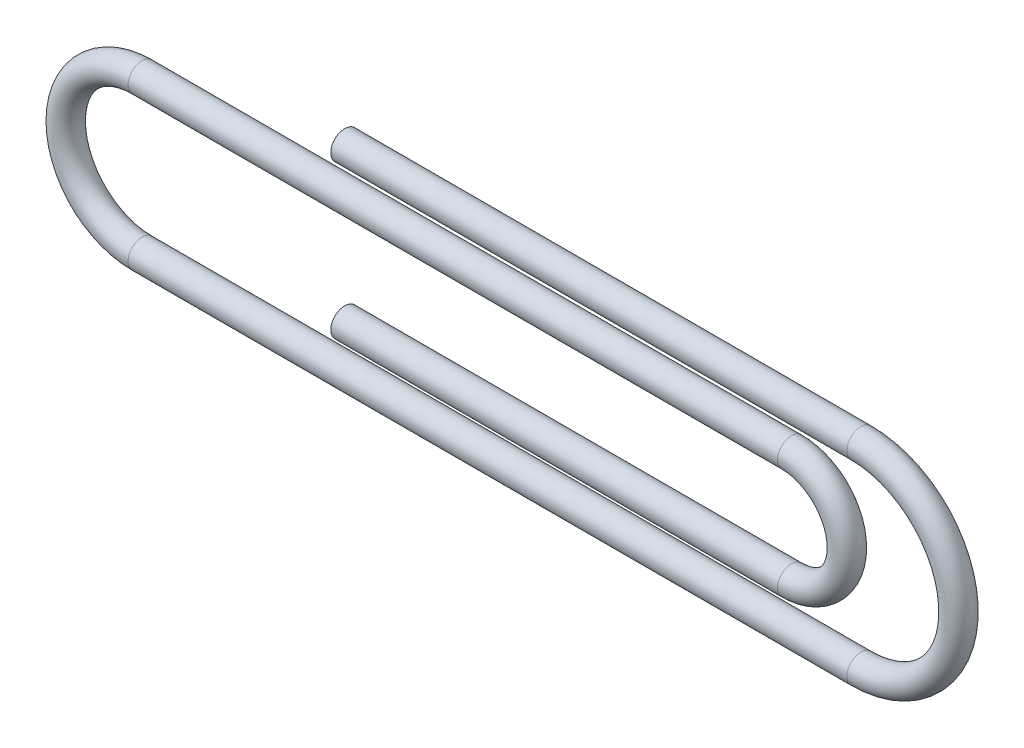
ISO-10303-21;
HEADER;
FILE_DESCRIPTION(('STEP AP214'),'2;1');
FILE_NAME('part.step','',(''),(''),'','','');
FILE_SCHEMA(('AUTOMOTIVE_DESIGN { 1 0 10303 214 1 1 1 1 }'));
ENDSEC;
DATA;
#1=APPLICATION_CONTEXT('core data for automotive mechanical design processes');
#2=APPLICATION_PROTOCOL_DEFINITION('international standard','automotive_design',2000,#1);
#3=PRODUCT_CONTEXT('',#1,'mechanical');
#4=PRODUCT('Part','Part','',(#3));
#5=PRODUCT_RELATED_PRODUCT_CATEGORY('part','',(#4));
#6=PRODUCT_DEFINITION_FORMATION('','',#4);
#7=PRODUCT_DEFINITION_CONTEXT('part definition',#1,'design');
#8=PRODUCT_DEFINITION('design','',#6,#7);
#9=PRODUCT_DEFINITION_SHAPE('','',#8);
#10=(LENGTH_UNIT() NAMED_UNIT(*) SI_UNIT(.MILLI.,.METRE.));
#11=(NAMED_UNIT(*) PLANE_ANGLE_UNIT() SI_UNIT($,.RADIAN.));
#12=(NAMED_UNIT(*) SI_UNIT($,.STERADIAN.) SOLID_ANGLE_UNIT());
#13=UNCERTAINTY_MEASURE_WITH_UNIT(LENGTH_MEASURE(1.E-05),#10,'distance_accuracy_value','');
#14=(GEOMETRIC_REPRESENTATION_CONTEXT(3) GLOBAL_UNCERTAINTY_ASSIGNED_CONTEXT((#13)) GLOBAL_UNIT_ASSIGNED_CONTEXT((#10,
#11,#12)) REPRESENTATION_CONTEXT('',''));
#15=CARTESIAN_POINT('',(0.,0.,0.));
#16=DIRECTION('',(0.,0.,1.));
#17=DIRECTION('',(1.,0.,0.));
#18=AXIS2_PLACEMENT_3D('',#15,#16,#17);
#19=CARTESIAN_POINT('',(0.,0.,0.));
#20=DIRECTION('',(1.,0.,0.));
#21=DIRECTION('',(0.,0.,-1.));
#22=AXIS2_PLACEMENT_3D('',#19,#20,#21);
#23=PLANE('',#22);
#24=CARTESIAN_POINT('',(0.,0.,0.));
#25=DIRECTION('',(1.,0.,0.));
#26=DIRECTION('',(0.,0.,-1.));
#27=AXIS2_PLACEMENT_3D('',#24,#25,#26);
#28=CIRCLE('',#27,0.5);
#29=CARTESIAN_POINT('',(0.,0.,-0.5));
#30=VERTEX_POINT('',#29);
#31=EDGE_CURVE('E78',#30,#30,#28,.T.);
#32=ORIENTED_EDGE('',*,*,#31,.F.);
#33=EDGE_LOOP('',(#32));
#34=FACE_BOUND('',#33,.T.);
#35=ADVANCED_FACE('F43',(#34),#23,.F.);
#36=CARTESIAN_POINT('',(0.,-5.50000000000001,0.));
#37=DIRECTION('',(-1.,0.,0.));
#38=DIRECTION('',(0.,0.,-1.));
#39=AXIS2_PLACEMENT_3D('',#36,#37,#38);
#40=PLANE('',#39);
#41=CARTESIAN_POINT('',(0.,-5.50000000000001,0.));
#42=DIRECTION('',(-1.,0.,0.));
#43=DIRECTION('',(0.,0.,-1.));
#44=AXIS2_PLACEMENT_3D('',#41,#42,#43);
#45=CIRCLE('',#44,0.5);
#46=CARTESIAN_POINT('',(0.,-5.50000000000001,-0.5));
#47=VERTEX_POINT('',#46);
#48=EDGE_CURVE('E10',#47,#47,#45,.T.);
#49=ORIENTED_EDGE('',*,*,#48,.T.);
#50=EDGE_LOOP('',(#49));
#51=FACE_BOUND('',#50,.T.);
#52=ADVANCED_FACE('F86',(#51),#40,.T.);
#53=CARTESIAN_POINT('',(0.,0.,0.));
#54=DIRECTION('',(1.,0.,0.));
#55=DIRECTION('',(0.,0.,-1.));
#56=AXIS2_PLACEMENT_3D('',#53,#54,#55);
#57=CYLINDRICAL_SURFACE('',#56,0.5);
#58=CARTESIAN_POINT('',(18.5,0.,0.));
#59=DIRECTION('',(1.,0.,0.));
#60=DIRECTION('',(0.,0.,-1.));
#61=AXIS2_PLACEMENT_3D('',#58,#59,#60);
#62=CIRCLE('',#61,0.5);
#63=CARTESIAN_POINT('',(18.5,0.5,0.));
#64=VERTEX_POINT('',#63);
#65=EDGE_CURVE('E74',#64,#64,#62,.T.);
#66=ORIENTED_EDGE('',*,*,#65,.F.);
#67=EDGE_LOOP('',(#66));
#68=FACE_BOUND('',#67,.T.);
#69=ORIENTED_EDGE('',*,*,#31,.T.);
#70=EDGE_LOOP('',(#69));
#71=FACE_BOUND('',#70,.T.);
#72=ADVANCED_FACE('F83',(#68,#71),#57,.T.);
#73=CARTESIAN_POINT('',(18.5,-3.5,0.));
#74=DIRECTION('',(0.,0.,-1.));
#75=DIRECTION('',(-1.,0.,0.));
#76=AXIS2_PLACEMENT_3D('',#73,#74,#75);
#77=TOROIDAL_SURFACE('',#76,3.5,0.5);
#78=CARTESIAN_POINT('',(18.5,-7.00000000000001,0.));
#79=DIRECTION('',(-1.,0.,0.));
#80=DIRECTION('',(0.,0.,-1.));
#81=AXIS2_PLACEMENT_3D('',#78,#79,#80);
#82=CIRCLE('',#81,0.5);
#83=CARTESIAN_POINT('',(18.5,-7.50000000000001,0.));
#84=VERTEX_POINT('',#83);
#85=EDGE_CURVE('E70',#84,#84,#82,.T.);
#86=CARTESIAN_POINT('',(18.5,-3.5,0.));
#87=DIRECTION('',(0.,0.,-1.));
#88=DIRECTION('',(-1.,0.,0.));
#89=AXIS2_PLACEMENT_3D('',#86,#87,#88);
#90=CIRCLE('',#89,4.);
#91=EDGE_CURVE('',#64,#84,#90,.T.);
#92=ORIENTED_EDGE('',*,*,#65,.T.);
#93=ORIENTED_EDGE('',*,*,#85,.F.);
#94=ORIENTED_EDGE('',*,*,#91,.T.);
#95=ORIENTED_EDGE('',*,*,#91,.F.);
#96=EDGE_LOOP('',(#92,#94,#93,#95));
#97=FACE_BOUND('',#96,.T.);
#98=ADVANCED_FACE('F112',(#97),#77,.T.);
#99=CARTESIAN_POINT('',(18.5,-7.00000000000001,0.));
#100=DIRECTION('',(-1.,0.,0.));
#101=DIRECTION('',(0.,-1.,0.));
#102=AXIS2_PLACEMENT_3D('',#99,#100,#101);
#103=CYLINDRICAL_SURFACE('',#102,0.5);
#104=CARTESIAN_POINT('',(-7.26395098630452,-7.00000000000001,0.));
#105=DIRECTION('',(-1.,0.,0.));
#106=DIRECTION('',(0.,0.,-1.));
#107=AXIS2_PLACEMENT_3D('',#104,#105,#106);
#108=CIRCLE('',#107,0.5);
#109=CARTESIAN_POINT('',(-7.26395098630452,-7.50000000000001,0.));
#110=VERTEX_POINT('',#109);
#111=EDGE_CURVE('E66',#110,#110,#108,.T.);
#112=ORIENTED_EDGE('',*,*,#111,.F.);
#113=EDGE_LOOP('',(#112));
#114=FACE_BOUND('',#113,.T.);
#115=ORIENTED_EDGE('',*,*,#85,.T.);
#116=EDGE_LOOP('',(#115));
#117=FACE_BOUND('',#116,.T.);
#118=ADVANCED_FACE('F108',(#114,#117),#103,.T.);
#119=CARTESIAN_POINT('',(-7.26395098630452,-4.26395098630453,0.));
#120=DIRECTION('',(0.,0.,-1.));
#121=DIRECTION('',(-1.,0.,0.));
#122=AXIS2_PLACEMENT_3D('',#119,#120,#121);
#123=TOROIDAL_SURFACE('',#122,2.73604901369548,0.5);
#124=CARTESIAN_POINT('',(-7.26395098630452,-1.52790197260905,0.));
#125=DIRECTION('',(1.,0.,0.));
#126=DIRECTION('',(0.,0.,-1.));
#127=AXIS2_PLACEMENT_3D('',#124,#125,#126);
#128=CIRCLE('',#127,0.5);
#129=CARTESIAN_POINT('',(-7.26395098630452,-1.02790197260905,0.));
#130=VERTEX_POINT('',#129);
#131=EDGE_CURVE('E60',#130,#130,#128,.T.);
#132=CARTESIAN_POINT('',(-7.26395098630452,-4.26395098630453,0.));
#133=DIRECTION('',(0.,0.,-1.));
#134=DIRECTION('',(-1.,0.,0.));
#135=AXIS2_PLACEMENT_3D('',#132,#133,#134);
#136=CIRCLE('',#135,3.23604901369548);
#137=EDGE_CURVE('',#110,#130,#136,.T.);
#138=ORIENTED_EDGE('',*,*,#111,.T.);
#139=ORIENTED_EDGE('',*,*,#131,.F.);
#140=ORIENTED_EDGE('',*,*,#137,.T.);
#141=ORIENTED_EDGE('',*,*,#137,.F.);
#142=EDGE_LOOP('',(#138,#140,#139,#141));
#143=FACE_BOUND('',#142,.T.);
#144=ADVANCED_FACE('F104',(#143),#123,.T.);
#145=CARTESIAN_POINT('',(-7.26395098630452,-1.52790197260905,0.));
#146=DIRECTION('',(1.,0.,0.));
#147=DIRECTION('',(0.,1.,0.));
#148=AXIS2_PLACEMENT_3D('',#145,#146,#147);
#149=CYLINDRICAL_SURFACE('',#148,0.5);
#150=CARTESIAN_POINT('',(16.0139509863045,-1.52790197260903,0.));
#151=DIRECTION('',(1.,0.,0.));
#152=DIRECTION('',(0.,0.,-1.));
#153=AXIS2_PLACEMENT_3D('',#150,#151,#152);
#154=CIRCLE('',#153,0.5);
#155=CARTESIAN_POINT('',(16.0139509863045,-1.02790197260903,0.));
#156=VERTEX_POINT('',#155);
#157=EDGE_CURVE('E55',#156,#156,#154,.T.);
#158=ORIENTED_EDGE('',*,*,#157,.F.);
#159=EDGE_LOOP('',(#158));
#160=FACE_BOUND('',#159,.T.);
#161=ORIENTED_EDGE('',*,*,#131,.T.);
#162=EDGE_LOOP('',(#161));
#163=FACE_BOUND('',#162,.T.);
#164=ADVANCED_FACE('F98',(#160,#163),#149,.T.);
#165=CARTESIAN_POINT('',(16.0139509863045,-3.51395098630452,0.));
#166=DIRECTION('',(0.,0.,-1.));
#167=DIRECTION('',(-1.,0.,0.));
#168=AXIS2_PLACEMENT_3D('',#165,#166,#167);
#169=TOROIDAL_SURFACE('',#168,1.98604901369549,0.5);
#170=CARTESIAN_POINT('',(16.0139509863045,-5.50000000000001,0.));
#171=DIRECTION('',(-1.,0.,0.));
#172=DIRECTION('',(0.,0.,-1.));
#173=AXIS2_PLACEMENT_3D('',#170,#171,#172);
#174=CIRCLE('',#173,0.5);
#175=CARTESIAN_POINT('',(16.0139509863045,-6.00000000000001,0.));
#176=VERTEX_POINT('',#175);
#177=EDGE_CURVE('E50',#176,#176,#174,.T.);
#178=CARTESIAN_POINT('',(16.0139509863045,-3.51395098630452,0.));
#179=DIRECTION('',(0.,0.,-1.));
#180=DIRECTION('',(-1.,0.,0.));
#181=AXIS2_PLACEMENT_3D('',#178,#179,#180);
#182=CIRCLE('',#181,2.48604901369549);
#183=EDGE_CURVE('',#156,#176,#182,.T.);
#184=ORIENTED_EDGE('',*,*,#157,.T.);
#185=ORIENTED_EDGE('',*,*,#177,.F.);
#186=ORIENTED_EDGE('',*,*,#183,.T.);
#187=ORIENTED_EDGE('',*,*,#183,.F.);
#188=EDGE_LOOP('',(#184,#186,#185,#187));
#189=FACE_BOUND('',#188,.T.);
#190=ADVANCED_FACE('F92',(#189),#169,.T.);
#191=CARTESIAN_POINT('',(16.0139509863045,-5.50000000000001,0.));
#192=DIRECTION('',(-1.,0.,0.));
#193=DIRECTION('',(0.,-1.,0.));
#194=AXIS2_PLACEMENT_3D('',#191,#192,#193);
#195=CYLINDRICAL_SURFACE('',#194,0.5);
#196=ORIENTED_EDGE('',*,*,#48,.F.);
#197=EDGE_LOOP('',(#196));
#198=FACE_BOUND('',#197,.T.);
#199=ORIENTED_EDGE('',*,*,#177,.T.);
#200=EDGE_LOOP('',(#199));
#201=FACE_BOUND('',#200,.T.);
#202=ADVANCED_FACE('F90',(#198,#201),#195,.T.);
#203=CLOSED_SHELL('',(#35,#52,#72,#98,#118,#144,#164,#190,#202));
#204=MANIFOLD_SOLID_BREP('B2',#203);
#205=ADVANCED_BREP_SHAPE_REPRESENTATION('',(#18,#204),#14);
#206=SHAPE_DEFINITION_REPRESENTATION(#9,#205);
ENDSEC;
END-ISO-10303-21;
